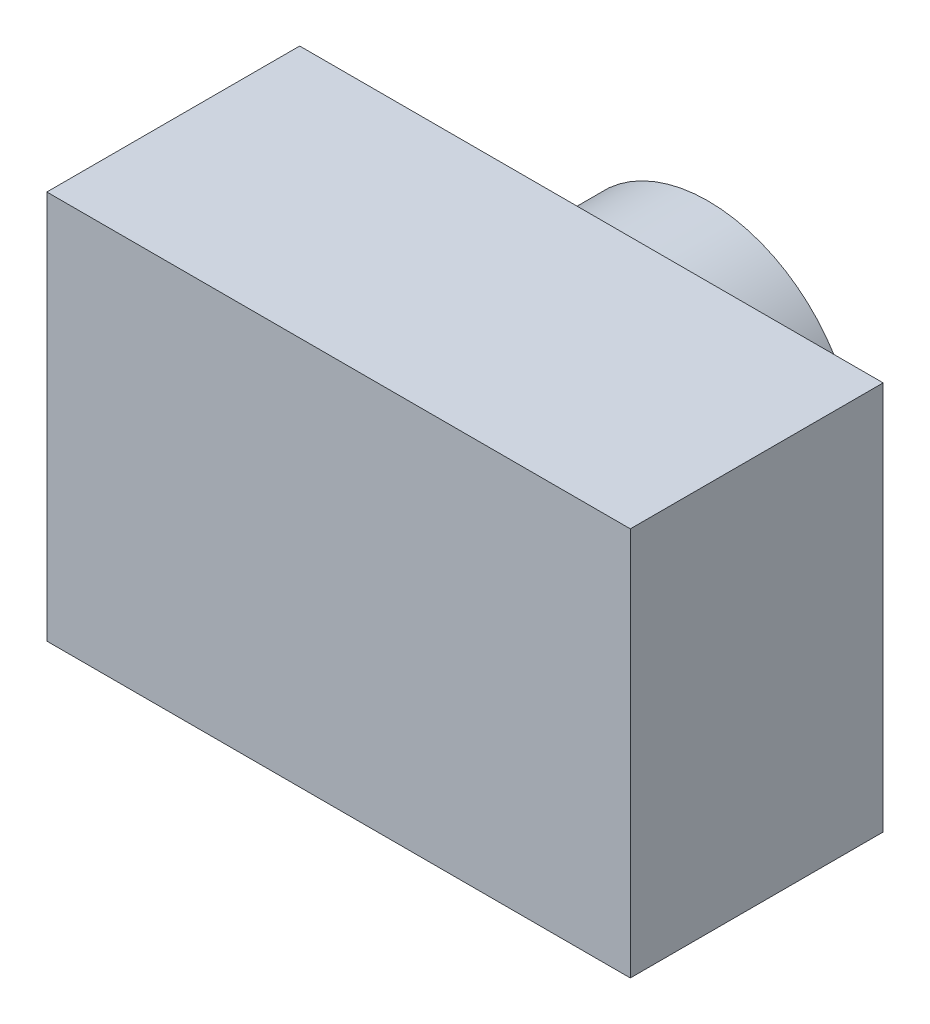
ISO-10303-21;
HEADER;
FILE_DESCRIPTION(('STEP AP214'),'2;1');
FILE_NAME('part.step','',(''),(''),'','','');
FILE_SCHEMA(('AUTOMOTIVE_DESIGN { 1 0 10303 214 1 1 1 1 }'));
ENDSEC;
DATA;
#1=APPLICATION_CONTEXT('core data for automotive mechanical design processes');
#2=APPLICATION_PROTOCOL_DEFINITION('international standard','automotive_design',2000,#1);
#3=PRODUCT_CONTEXT('',#1,'mechanical');
#4=PRODUCT('Part','Part','',(#3));
#5=PRODUCT_RELATED_PRODUCT_CATEGORY('part','',(#4));
#6=PRODUCT_DEFINITION_FORMATION('','',#4);
#7=PRODUCT_DEFINITION_CONTEXT('part definition',#1,'design');
#8=PRODUCT_DEFINITION('design','',#6,#7);
#9=PRODUCT_DEFINITION_SHAPE('','',#8);
#10=(LENGTH_UNIT() NAMED_UNIT(*) SI_UNIT(.MILLI.,.METRE.));
#11=(NAMED_UNIT(*) PLANE_ANGLE_UNIT() SI_UNIT($,.RADIAN.));
#12=(NAMED_UNIT(*) SI_UNIT($,.STERADIAN.) SOLID_ANGLE_UNIT());
#13=UNCERTAINTY_MEASURE_WITH_UNIT(LENGTH_MEASURE(1.E-05),#10,'distance_accuracy_value','');
#14=(GEOMETRIC_REPRESENTATION_CONTEXT(3) GLOBAL_UNCERTAINTY_ASSIGNED_CONTEXT((#13)) GLOBAL_UNIT_ASSIGNED_CONTEXT((#10,
#11,#12)) REPRESENTATION_CONTEXT('',''));
#15=CARTESIAN_POINT('',(0.,0.,0.));
#16=DIRECTION('',(0.,0.,1.));
#17=DIRECTION('',(1.,0.,0.));
#18=AXIS2_PLACEMENT_3D('',#15,#16,#17);
#19=CARTESIAN_POINT('',(75.,50.,65.));
#20=DIRECTION('',(-1.,0.,0.));
#21=DIRECTION('',(0.,0.,1.));
#22=AXIS2_PLACEMENT_3D('',#19,#20,#21);
#23=PLANE('',#22);
#24=DIRECTION('',(0.,1.,0.));
#25=VECTOR('',#24,1.);
#26=CARTESIAN_POINT('',(75.,50.,0.));
#27=LINE('',#26,#25);
#28=CARTESIAN_POINT('',(75.,-50.,0.));
#29=VERTEX_POINT('',#28);
#30=CARTESIAN_POINT('',(75.,50.,0.));
#31=VERTEX_POINT('',#30);
#32=EDGE_CURVE('E149',#29,#31,#27,.T.);
#33=ORIENTED_EDGE('',*,*,#32,.T.);
#34=DIRECTION('',(0.,0.,-1.));
#35=VECTOR('',#34,1.);
#36=CARTESIAN_POINT('',(75.,50.,65.));
#37=LINE('',#36,#35);
#38=CARTESIAN_POINT('',(75.,50.,65.));
#39=VERTEX_POINT('',#38);
#40=EDGE_CURVE('E41',#39,#31,#37,.T.);
#41=ORIENTED_EDGE('',*,*,#40,.F.);
#42=DIRECTION('',(0.,1.,0.));
#43=VECTOR('',#42,1.);
#44=CARTESIAN_POINT('',(75.,50.,65.));
#45=LINE('',#44,#43);
#46=CARTESIAN_POINT('',(75.,-50.,65.));
#47=VERTEX_POINT('',#46);
#48=EDGE_CURVE('E153',#47,#39,#45,.T.);
#49=ORIENTED_EDGE('',*,*,#48,.F.);
#50=DIRECTION('',(0.,0.,-1.));
#51=VECTOR('',#50,1.);
#52=CARTESIAN_POINT('',(75.,-50.,65.));
#53=LINE('',#52,#51);
#54=EDGE_CURVE('E159',#47,#29,#53,.T.);
#55=ORIENTED_EDGE('',*,*,#54,.T.);
#56=EDGE_LOOP('',(#33,#41,#49,#55));
#57=FACE_BOUND('',#56,.T.);
#58=ADVANCED_FACE('F33',(#57),#23,.F.);
#59=CARTESIAN_POINT('',(-75.,50.,65.));
#60=DIRECTION('',(0.,-1.,0.));
#61=DIRECTION('',(0.,0.,-1.));
#62=AXIS2_PLACEMENT_3D('',#59,#60,#61);
#63=PLANE('',#62);
#64=DIRECTION('',(-1.,0.,0.));
#65=VECTOR('',#64,1.);
#66=CARTESIAN_POINT('',(-75.,50.,0.));
#67=LINE('',#66,#65);
#68=CARTESIAN_POINT('',(-75.,50.,0.));
#69=VERTEX_POINT('',#68);
#70=EDGE_CURVE('E162',#31,#69,#67,.T.);
#71=ORIENTED_EDGE('',*,*,#70,.T.);
#72=DIRECTION('',(0.,0.,-1.));
#73=VECTOR('',#72,1.);
#74=CARTESIAN_POINT('',(-75.,50.,65.));
#75=LINE('',#74,#73);
#76=CARTESIAN_POINT('',(-75.,50.,65.));
#77=VERTEX_POINT('',#76);
#78=EDGE_CURVE('E169',#77,#69,#75,.T.);
#79=ORIENTED_EDGE('',*,*,#78,.F.);
#80=DIRECTION('',(-1.,0.,0.));
#81=VECTOR('',#80,1.);
#82=CARTESIAN_POINT('',(-75.,50.,65.));
#83=LINE('',#82,#81);
#84=EDGE_CURVE('E81',#39,#77,#83,.T.);
#85=ORIENTED_EDGE('',*,*,#84,.F.);
#86=ORIENTED_EDGE('',*,*,#40,.T.);
#87=EDGE_LOOP('',(#71,#79,#85,#86));
#88=FACE_BOUND('',#87,.T.);
#89=ADVANCED_FACE('F171',(#88),#63,.F.);
#90=CARTESIAN_POINT('',(-75.,50.,65.));
#91=DIRECTION('',(1.,0.,0.));
#92=DIRECTION('',(0.,0.,-1.));
#93=AXIS2_PLACEMENT_3D('',#90,#91,#92);
#94=PLANE('',#93);
#95=DIRECTION('',(0.,-1.,0.));
#96=VECTOR('',#95,1.);
#97=CARTESIAN_POINT('',(-75.,50.,0.));
#98=LINE('',#97,#96);
#99=CARTESIAN_POINT('',(-75.,-50.,0.));
#100=VERTEX_POINT('',#99);
#101=EDGE_CURVE('E67',#69,#100,#98,.T.);
#102=ORIENTED_EDGE('',*,*,#101,.T.);
#103=DIRECTION('',(0.,0.,-1.));
#104=VECTOR('',#103,1.);
#105=CARTESIAN_POINT('',(-75.,-50.,65.));
#106=LINE('',#105,#104);
#107=CARTESIAN_POINT('',(-75.,-50.,65.));
#108=VERTEX_POINT('',#107);
#109=EDGE_CURVE('E167',#108,#100,#106,.T.);
#110=ORIENTED_EDGE('',*,*,#109,.F.);
#111=DIRECTION('',(0.,-1.,0.));
#112=VECTOR('',#111,1.);
#113=CARTESIAN_POINT('',(-75.,50.,65.));
#114=LINE('',#113,#112);
#115=EDGE_CURVE('E156',#77,#108,#114,.T.);
#116=ORIENTED_EDGE('',*,*,#115,.F.);
#117=ORIENTED_EDGE('',*,*,#78,.T.);
#118=EDGE_LOOP('',(#102,#110,#116,#117));
#119=FACE_BOUND('',#118,.T.);
#120=ADVANCED_FACE('F197',(#119),#94,.F.);
#121=CARTESIAN_POINT('',(-75.,-50.,65.));
#122=DIRECTION('',(0.,1.,0.));
#123=DIRECTION('',(0.,0.,1.));
#124=AXIS2_PLACEMENT_3D('',#121,#122,#123);
#125=PLANE('',#124);
#126=DIRECTION('',(1.,0.,0.));
#127=VECTOR('',#126,1.);
#128=CARTESIAN_POINT('',(-75.,-50.,0.));
#129=LINE('',#128,#127);
#130=EDGE_CURVE('E73',#100,#29,#129,.T.);
#131=ORIENTED_EDGE('',*,*,#130,.T.);
#132=ORIENTED_EDGE('',*,*,#54,.F.);
#133=DIRECTION('',(1.,0.,0.));
#134=VECTOR('',#133,1.);
#135=CARTESIAN_POINT('',(-75.,-50.,65.));
#136=LINE('',#135,#134);
#137=EDGE_CURVE('E49',#108,#47,#136,.T.);
#138=ORIENTED_EDGE('',*,*,#137,.F.);
#139=ORIENTED_EDGE('',*,*,#109,.T.);
#140=EDGE_LOOP('',(#131,#132,#138,#139));
#141=FACE_BOUND('',#140,.T.);
#142=ADVANCED_FACE('F189',(#141),#125,.F.);
#143=CARTESIAN_POINT('',(0.,0.,65.));
#144=DIRECTION('',(0.,0.,1.));
#145=DIRECTION('',(1.,0.,0.));
#146=AXIS2_PLACEMENT_3D('',#143,#144,#145);
#147=PLANE('',#146);
#148=ORIENTED_EDGE('',*,*,#48,.T.);
#149=ORIENTED_EDGE('',*,*,#84,.T.);
#150=ORIENTED_EDGE('',*,*,#115,.T.);
#151=ORIENTED_EDGE('',*,*,#137,.T.);
#152=EDGE_LOOP('',(#148,#149,#150,#151));
#153=FACE_BOUND('',#152,.T.);
#154=ADVANCED_FACE('F179',(#153),#147,.T.);
#155=CARTESIAN_POINT('',(0.,0.,0.));
#156=DIRECTION('',(0.,0.,1.));
#157=DIRECTION('',(1.,0.,0.));
#158=AXIS2_PLACEMENT_3D('',#155,#156,#157);
#159=PLANE('',#158);
#160=CARTESIAN_POINT('',(0.,0.,0.));
#161=DIRECTION('',(0.,0.,1.));
#162=DIRECTION('',(1.,0.,0.));
#163=AXIS2_PLACEMENT_3D('',#160,#161,#162);
#164=CIRCLE('',#163,38.);
#165=CARTESIAN_POINT('',(38.,0.,0.));
#166=VERTEX_POINT('',#165);
#167=EDGE_CURVE('E11',#166,#166,#164,.F.);
#168=ORIENTED_EDGE('',*,*,#167,.F.);
#169=EDGE_LOOP('',(#168));
#170=FACE_BOUND('',#169,.T.);
#171=ORIENTED_EDGE('',*,*,#32,.F.);
#172=ORIENTED_EDGE('',*,*,#130,.F.);
#173=ORIENTED_EDGE('',*,*,#101,.F.);
#174=ORIENTED_EDGE('',*,*,#70,.F.);
#175=EDGE_LOOP('',(#171,#172,#173,#174));
#176=FACE_BOUND('',#175,.T.);
#177=ADVANCED_FACE('F176',(#170,#176),#159,.F.);
#178=CARTESIAN_POINT('',(0.,0.,-30.));
#179=DIRECTION('',(0.,0.,1.));
#180=DIRECTION('',(1.,0.,0.));
#181=AXIS2_PLACEMENT_3D('',#178,#179,#180);
#182=CYLINDRICAL_SURFACE('',#181,38.);
#183=CARTESIAN_POINT('',(0.,0.,-30.));
#184=DIRECTION('',(0.,0.,-1.));
#185=DIRECTION('',(-1.,0.,0.));
#186=AXIS2_PLACEMENT_3D('',#183,#184,#185);
#187=CIRCLE('',#186,38.);
#188=CARTESIAN_POINT('',(-38.,0.,-30.));
#189=VERTEX_POINT('',#188);
#190=EDGE_CURVE('E138',#189,#189,#187,.T.);
#191=ORIENTED_EDGE('',*,*,#190,.F.);
#192=EDGE_LOOP('',(#191));
#193=FACE_BOUND('',#192,.T.);
#194=ORIENTED_EDGE('',*,*,#167,.T.);
#195=EDGE_LOOP('',(#194));
#196=FACE_BOUND('',#195,.T.);
#197=ADVANCED_FACE('F178',(#193,#196),#182,.T.);
#198=CARTESIAN_POINT('',(0.,0.,-30.));
#199=DIRECTION('',(0.,0.,-1.));
#200=DIRECTION('',(-1.,0.,0.));
#201=AXIS2_PLACEMENT_3D('',#198,#199,#200);
#202=PLANE('',#201);
#203=ORIENTED_EDGE('',*,*,#190,.T.);
#204=EDGE_LOOP('',(#203));
#205=FACE_BOUND('',#204,.T.);
#206=ADVANCED_FACE('F186',(#205),#202,.T.);
#207=CLOSED_SHELL('',(#58,#89,#120,#142,#154,#177,#197,#206));
#208=CARTESIAN_POINT('',(-70.,-45.,5.));
#209=DIRECTION('',(0.,-1.,0.));
#210=DIRECTION('',(0.,0.,-1.));
#211=AXIS2_PLACEMENT_3D('',#208,#209,#210);
#212=PLANE('',#211);
#213=DIRECTION('',(1.,0.,0.));
#214=VECTOR('',#213,1.);
#215=CARTESIAN_POINT('',(-70.,-45.,60.));
#216=LINE('',#215,#214);
#217=CARTESIAN_POINT('',(-70.,-45.,60.));
#218=VERTEX_POINT('',#217);
#219=CARTESIAN_POINT('',(70.,-45.,60.));
#220=VERTEX_POINT('',#219);
#221=EDGE_CURVE('E115',#218,#220,#216,.T.);
#222=ORIENTED_EDGE('',*,*,#221,.T.);
#223=DIRECTION('',(0.,0.,1.));
#224=VECTOR('',#223,1.);
#225=CARTESIAN_POINT('',(70.,-45.,5.));
#226=LINE('',#225,#224);
#227=CARTESIAN_POINT('',(70.,-45.,5.));
#228=VERTEX_POINT('',#227);
#229=EDGE_CURVE('E108',#228,#220,#226,.T.);
#230=ORIENTED_EDGE('',*,*,#229,.F.);
#231=DIRECTION('',(1.,0.,0.));
#232=VECTOR('',#231,1.);
#233=CARTESIAN_POINT('',(-70.,-45.,5.));
#234=LINE('',#233,#232);
#235=CARTESIAN_POINT('',(-70.,-45.,5.));
#236=VERTEX_POINT('',#235);
#237=EDGE_CURVE('E112',#236,#228,#234,.T.);
#238=ORIENTED_EDGE('',*,*,#237,.F.);
#239=DIRECTION('',(0.,0.,1.));
#240=VECTOR('',#239,1.);
#241=CARTESIAN_POINT('',(-70.,-45.,5.));
#242=LINE('',#241,#240);
#243=EDGE_CURVE('E147',#236,#218,#242,.T.);
#244=ORIENTED_EDGE('',*,*,#243,.T.);
#245=EDGE_LOOP('',(#222,#230,#238,#244));
#246=FACE_BOUND('',#245,.T.);
#247=ADVANCED_FACE('F110',(#246),#212,.F.);
#248=CARTESIAN_POINT('',(-70.,45.,5.));
#249=DIRECTION('',(-1.,0.,0.));
#250=DIRECTION('',(0.,0.,1.));
#251=AXIS2_PLACEMENT_3D('',#248,#249,#250);
#252=PLANE('',#251);
#253=DIRECTION('',(0.,-1.,0.));
#254=VECTOR('',#253,1.);
#255=CARTESIAN_POINT('',(-70.,45.,60.));
#256=LINE('',#255,#254);
#257=CARTESIAN_POINT('',(-70.,45.,60.));
#258=VERTEX_POINT('',#257);
#259=EDGE_CURVE('E132',#258,#218,#256,.T.);
#260=ORIENTED_EDGE('',*,*,#259,.T.);
#261=ORIENTED_EDGE('',*,*,#243,.F.);
#262=DIRECTION('',(0.,-1.,0.));
#263=VECTOR('',#262,1.);
#264=CARTESIAN_POINT('',(-70.,45.,5.));
#265=LINE('',#264,#263);
#266=CARTESIAN_POINT('',(-70.,45.,5.));
#267=VERTEX_POINT('',#266);
#268=EDGE_CURVE('E120',#267,#236,#265,.T.);
#269=ORIENTED_EDGE('',*,*,#268,.F.);
#270=DIRECTION('',(0.,0.,1.));
#271=VECTOR('',#270,1.);
#272=CARTESIAN_POINT('',(-70.,45.,5.));
#273=LINE('',#272,#271);
#274=EDGE_CURVE('E150',#267,#258,#273,.T.);
#275=ORIENTED_EDGE('',*,*,#274,.T.);
#276=EDGE_LOOP('',(#260,#261,#269,#275));
#277=FACE_BOUND('',#276,.T.);
#278=ADVANCED_FACE('F221',(#277),#252,.F.);
#279=CARTESIAN_POINT('',(70.,45.,5.));
#280=DIRECTION('',(0.,1.,0.));
#281=DIRECTION('',(0.,0.,1.));
#282=AXIS2_PLACEMENT_3D('',#279,#280,#281);
#283=PLANE('',#282);
#284=DIRECTION('',(-1.,0.,0.));
#285=VECTOR('',#284,1.);
#286=CARTESIAN_POINT('',(70.,45.,60.));
#287=LINE('',#286,#285);
#288=CARTESIAN_POINT('',(70.,45.,60.));
#289=VERTEX_POINT('',#288);
#290=EDGE_CURVE('E135',#289,#258,#287,.T.);
#291=ORIENTED_EDGE('',*,*,#290,.T.);
#292=ORIENTED_EDGE('',*,*,#274,.F.);
#293=DIRECTION('',(-1.,0.,0.));
#294=VECTOR('',#293,1.);
#295=CARTESIAN_POINT('',(70.,45.,5.));
#296=LINE('',#295,#294);
#297=CARTESIAN_POINT('',(70.,45.,5.));
#298=VERTEX_POINT('',#297);
#299=EDGE_CURVE('E128',#298,#267,#296,.T.);
#300=ORIENTED_EDGE('',*,*,#299,.F.);
#301=DIRECTION('',(0.,0.,1.));
#302=VECTOR('',#301,1.);
#303=CARTESIAN_POINT('',(70.,45.,5.));
#304=LINE('',#303,#302);
#305=EDGE_CURVE('E119',#298,#289,#304,.T.);
#306=ORIENTED_EDGE('',*,*,#305,.T.);
#307=EDGE_LOOP('',(#291,#292,#300,#306));
#308=FACE_BOUND('',#307,.T.);
#309=ADVANCED_FACE('F232',(#308),#283,.F.);
#310=CARTESIAN_POINT('',(70.,-45.,5.));
#311=DIRECTION('',(1.,0.,0.));
#312=DIRECTION('',(0.,0.,-1.));
#313=AXIS2_PLACEMENT_3D('',#310,#311,#312);
#314=PLANE('',#313);
#315=DIRECTION('',(0.,1.,0.));
#316=VECTOR('',#315,1.);
#317=CARTESIAN_POINT('',(70.,-45.,60.));
#318=LINE('',#317,#316);
#319=EDGE_CURVE('E143',#220,#289,#318,.T.);
#320=ORIENTED_EDGE('',*,*,#319,.T.);
#321=ORIENTED_EDGE('',*,*,#305,.F.);
#322=DIRECTION('',(0.,1.,0.));
#323=VECTOR('',#322,1.);
#324=CARTESIAN_POINT('',(70.,-45.,5.));
#325=LINE('',#324,#323);
#326=EDGE_CURVE('E123',#228,#298,#325,.T.);
#327=ORIENTED_EDGE('',*,*,#326,.F.);
#328=ORIENTED_EDGE('',*,*,#229,.T.);
#329=EDGE_LOOP('',(#320,#321,#327,#328));
#330=FACE_BOUND('',#329,.T.);
#331=ADVANCED_FACE('F124',(#330),#314,.F.);
#332=CARTESIAN_POINT('',(0.,0.,5.));
#333=DIRECTION('',(0.,0.,1.));
#334=DIRECTION('',(1.,0.,0.));
#335=AXIS2_PLACEMENT_3D('',#332,#333,#334);
#336=PLANE('',#335);
#337=ORIENTED_EDGE('',*,*,#237,.T.);
#338=ORIENTED_EDGE('',*,*,#326,.T.);
#339=ORIENTED_EDGE('',*,*,#299,.T.);
#340=ORIENTED_EDGE('',*,*,#268,.T.);
#341=EDGE_LOOP('',(#337,#338,#339,#340));
#342=FACE_BOUND('',#341,.T.);
#343=ADVANCED_FACE('F130',(#342),#336,.T.);
#344=CARTESIAN_POINT('',(0.,0.,60.));
#345=DIRECTION('',(0.,0.,1.));
#346=DIRECTION('',(1.,0.,0.));
#347=AXIS2_PLACEMENT_3D('',#344,#345,#346);
#348=PLANE('',#347);
#349=ORIENTED_EDGE('',*,*,#221,.F.);
#350=ORIENTED_EDGE('',*,*,#259,.F.);
#351=ORIENTED_EDGE('',*,*,#290,.F.);
#352=ORIENTED_EDGE('',*,*,#319,.F.);
#353=EDGE_LOOP('',(#349,#350,#351,#352));
#354=FACE_BOUND('',#353,.T.);
#355=ADVANCED_FACE('F259',(#354),#348,.F.);
#356=CLOSED_SHELL('',(#247,#278,#309,#331,#343,#355));
#357=ORIENTED_CLOSED_SHELL('',*,#356,.T.);
#358=BREP_WITH_VOIDS('B2',#207,(#357));
#359=ADVANCED_BREP_SHAPE_REPRESENTATION('',(#18,#358),#14);
#360=SHAPE_DEFINITION_REPRESENTATION(#9,#359);
ENDSEC;
END-ISO-10303-21;
